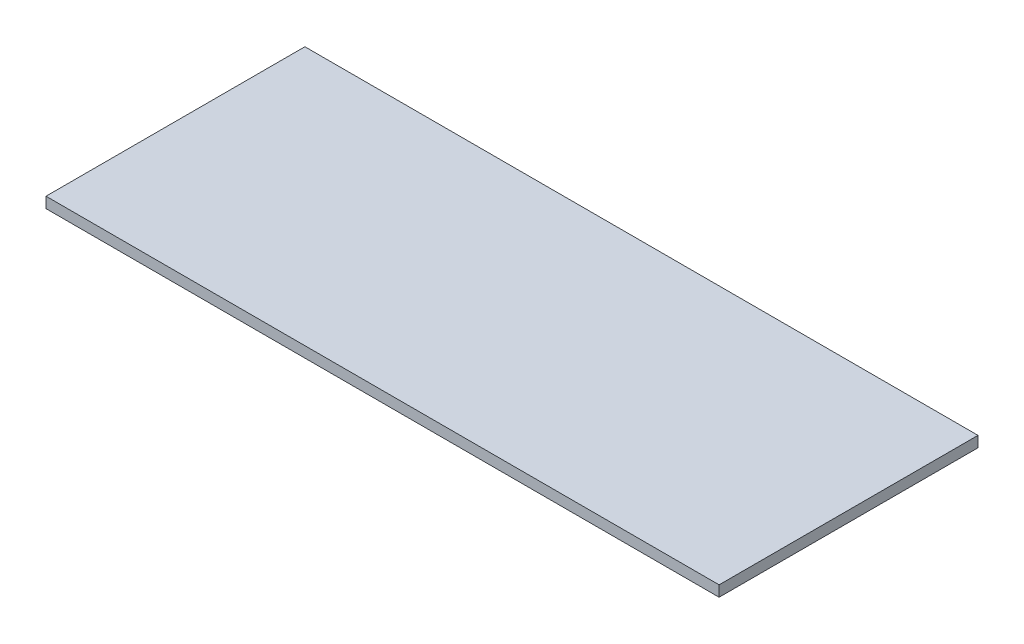
ISO-10303-21;
HEADER;
FILE_DESCRIPTION(('STEP AP214'),'2;1');
FILE_NAME('part.step','',(''),(''),'','','');
FILE_SCHEMA(('AUTOMOTIVE_DESIGN { 1 0 10303 214 1 1 1 1 }'));
ENDSEC;
DATA;
#1=APPLICATION_CONTEXT('core data for automotive mechanical design processes');
#2=APPLICATION_PROTOCOL_DEFINITION('international standard','automotive_design',2000,#1);
#3=PRODUCT_CONTEXT('',#1,'mechanical');
#4=PRODUCT('Part','Part','',(#3));
#5=PRODUCT_RELATED_PRODUCT_CATEGORY('part','',(#4));
#6=PRODUCT_DEFINITION_FORMATION('','',#4);
#7=PRODUCT_DEFINITION_CONTEXT('part definition',#1,'design');
#8=PRODUCT_DEFINITION('design','',#6,#7);
#9=PRODUCT_DEFINITION_SHAPE('','',#8);
#10=(LENGTH_UNIT() NAMED_UNIT(*) SI_UNIT(.MILLI.,.METRE.));
#11=(NAMED_UNIT(*) PLANE_ANGLE_UNIT() SI_UNIT($,.RADIAN.));
#12=(NAMED_UNIT(*) SI_UNIT($,.STERADIAN.) SOLID_ANGLE_UNIT());
#13=UNCERTAINTY_MEASURE_WITH_UNIT(LENGTH_MEASURE(1.E-05),#10,'distance_accuracy_value','');
#14=(GEOMETRIC_REPRESENTATION_CONTEXT(3) GLOBAL_UNCERTAINTY_ASSIGNED_CONTEXT((#13)) GLOBAL_UNIT_ASSIGNED_CONTEXT((#10,
#11,#12)) REPRESENTATION_CONTEXT('',''));
#15=CARTESIAN_POINT('',(0.,0.,0.));
#16=DIRECTION('',(0.,0.,1.));
#17=DIRECTION('',(1.,0.,0.));
#18=AXIS2_PLACEMENT_3D('',#15,#16,#17);
#19=CARTESIAN_POINT('',(0.,3.175,0.));
#20=DIRECTION('',(1.,0.,0.));
#21=DIRECTION('',(0.,0.,-1.));
#22=AXIS2_PLACEMENT_3D('',#19,#20,#21);
#23=PLANE('',#22);
#24=DIRECTION('',(0.,0.,1.));
#25=VECTOR('',#24,1.);
#26=CARTESIAN_POINT('',(0.,0.,0.));
#27=LINE('',#26,#25);
#28=CARTESIAN_POINT('',(0.,0.,-76.2));
#29=VERTEX_POINT('',#28);
#30=CARTESIAN_POINT('',(0.,0.,0.));
#31=VERTEX_POINT('',#30);
#32=EDGE_CURVE('E96',#29,#31,#27,.T.);
#33=ORIENTED_EDGE('',*,*,#32,.T.);
#34=DIRECTION('',(0.,-1.,0.));
#35=VECTOR('',#34,1.);
#36=CARTESIAN_POINT('',(0.,3.175,0.));
#37=LINE('',#36,#35);
#38=CARTESIAN_POINT('',(0.,3.175,0.));
#39=VERTEX_POINT('',#38);
#40=EDGE_CURVE('E11',#39,#31,#37,.T.);
#41=ORIENTED_EDGE('',*,*,#40,.F.);
#42=DIRECTION('',(0.,0.,1.));
#43=VECTOR('',#42,1.);
#44=CARTESIAN_POINT('',(0.,3.175,0.));
#45=LINE('',#44,#43);
#46=CARTESIAN_POINT('',(0.,3.175,-76.2));
#47=VERTEX_POINT('',#46);
#48=EDGE_CURVE('E84',#47,#39,#45,.T.);
#49=ORIENTED_EDGE('',*,*,#48,.F.);
#50=DIRECTION('',(0.,-1.,0.));
#51=VECTOR('',#50,1.);
#52=CARTESIAN_POINT('',(0.,3.175,-76.2));
#53=LINE('',#52,#51);
#54=EDGE_CURVE('E92',#47,#29,#53,.T.);
#55=ORIENTED_EDGE('',*,*,#54,.T.);
#56=EDGE_LOOP('',(#33,#41,#49,#55));
#57=FACE_BOUND('',#56,.T.);
#58=ADVANCED_FACE('F33',(#57),#23,.F.);
#59=CARTESIAN_POINT('',(0.,3.175,0.));
#60=DIRECTION('',(0.,0.,-1.));
#61=DIRECTION('',(-1.,0.,0.));
#62=AXIS2_PLACEMENT_3D('',#59,#60,#61);
#63=PLANE('',#62);
#64=DIRECTION('',(1.,0.,0.));
#65=VECTOR('',#64,1.);
#66=CARTESIAN_POINT('',(0.,0.,0.));
#67=LINE('',#66,#65);
#68=CARTESIAN_POINT('',(198.12,0.,0.));
#69=VERTEX_POINT('',#68);
#70=EDGE_CURVE('E88',#31,#69,#67,.T.);
#71=ORIENTED_EDGE('',*,*,#70,.T.);
#72=DIRECTION('',(0.,-1.,0.));
#73=VECTOR('',#72,1.);
#74=CARTESIAN_POINT('',(198.12,3.175,0.));
#75=LINE('',#74,#73);
#76=CARTESIAN_POINT('',(198.12,3.175,0.));
#77=VERTEX_POINT('',#76);
#78=EDGE_CURVE('E41',#77,#69,#75,.T.);
#79=ORIENTED_EDGE('',*,*,#78,.F.);
#80=DIRECTION('',(1.,0.,0.));
#81=VECTOR('',#80,1.);
#82=CARTESIAN_POINT('',(0.,3.175,0.));
#83=LINE('',#82,#81);
#84=EDGE_CURVE('E79',#39,#77,#83,.T.);
#85=ORIENTED_EDGE('',*,*,#84,.F.);
#86=ORIENTED_EDGE('',*,*,#40,.T.);
#87=EDGE_LOOP('',(#71,#79,#85,#86));
#88=FACE_BOUND('',#87,.T.);
#89=ADVANCED_FACE('F87',(#88),#63,.F.);
#90=CARTESIAN_POINT('',(198.12,3.175,0.));
#91=DIRECTION('',(-1.,0.,0.));
#92=DIRECTION('',(0.,0.,1.));
#93=AXIS2_PLACEMENT_3D('',#90,#91,#92);
#94=PLANE('',#93);
#95=DIRECTION('',(0.,0.,-1.));
#96=VECTOR('',#95,1.);
#97=CARTESIAN_POINT('',(198.12,0.,0.));
#98=LINE('',#97,#96);
#99=CARTESIAN_POINT('',(198.12,0.,-76.2));
#100=VERTEX_POINT('',#99);
#101=EDGE_CURVE('E66',#69,#100,#98,.T.);
#102=ORIENTED_EDGE('',*,*,#101,.T.);
#103=DIRECTION('',(0.,-1.,0.));
#104=VECTOR('',#103,1.);
#105=CARTESIAN_POINT('',(198.12,3.175,-76.2));
#106=LINE('',#105,#104);
#107=CARTESIAN_POINT('',(198.12,3.175,-76.2));
#108=VERTEX_POINT('',#107);
#109=EDGE_CURVE('E89',#108,#100,#106,.T.);
#110=ORIENTED_EDGE('',*,*,#109,.F.);
#111=DIRECTION('',(0.,0.,-1.));
#112=VECTOR('',#111,1.);
#113=CARTESIAN_POINT('',(198.12,3.175,0.));
#114=LINE('',#113,#112);
#115=EDGE_CURVE('E82',#77,#108,#114,.T.);
#116=ORIENTED_EDGE('',*,*,#115,.F.);
#117=ORIENTED_EDGE('',*,*,#78,.T.);
#118=EDGE_LOOP('',(#102,#110,#116,#117));
#119=FACE_BOUND('',#118,.T.);
#120=ADVANCED_FACE('F90',(#119),#94,.F.);
#121=CARTESIAN_POINT('',(0.,3.175,-76.2));
#122=DIRECTION('',(0.,0.,1.));
#123=DIRECTION('',(1.,0.,0.));
#124=AXIS2_PLACEMENT_3D('',#121,#122,#123);
#125=PLANE('',#124);
#126=DIRECTION('',(-1.,0.,0.));
#127=VECTOR('',#126,1.);
#128=CARTESIAN_POINT('',(0.,0.,-76.2));
#129=LINE('',#128,#127);
#130=EDGE_CURVE('E72',#100,#29,#129,.T.);
#131=ORIENTED_EDGE('',*,*,#130,.T.);
#132=ORIENTED_EDGE('',*,*,#54,.F.);
#133=DIRECTION('',(-1.,0.,0.));
#134=VECTOR('',#133,1.);
#135=CARTESIAN_POINT('',(0.,3.175,-76.2));
#136=LINE('',#135,#134);
#137=EDGE_CURVE('E49',#108,#47,#136,.T.);
#138=ORIENTED_EDGE('',*,*,#137,.F.);
#139=ORIENTED_EDGE('',*,*,#109,.T.);
#140=EDGE_LOOP('',(#131,#132,#138,#139));
#141=FACE_BOUND('',#140,.T.);
#142=ADVANCED_FACE('F103',(#141),#125,.F.);
#143=CARTESIAN_POINT('',(0.,3.175,0.));
#144=DIRECTION('',(0.,-1.,0.));
#145=DIRECTION('',(0.,0.,-1.));
#146=AXIS2_PLACEMENT_3D('',#143,#144,#145);
#147=PLANE('',#146);
#148=ORIENTED_EDGE('',*,*,#48,.T.);
#149=ORIENTED_EDGE('',*,*,#84,.T.);
#150=ORIENTED_EDGE('',*,*,#115,.T.);
#151=ORIENTED_EDGE('',*,*,#137,.T.);
#152=EDGE_LOOP('',(#148,#149,#150,#151));
#153=FACE_BOUND('',#152,.T.);
#154=ADVANCED_FACE('F80',(#153),#147,.F.);
#155=CARTESIAN_POINT('',(0.,0.,0.));
#156=DIRECTION('',(0.,-1.,0.));
#157=DIRECTION('',(0.,0.,-1.));
#158=AXIS2_PLACEMENT_3D('',#155,#156,#157);
#159=PLANE('',#158);
#160=ORIENTED_EDGE('',*,*,#32,.F.);
#161=ORIENTED_EDGE('',*,*,#130,.F.);
#162=ORIENTED_EDGE('',*,*,#101,.F.);
#163=ORIENTED_EDGE('',*,*,#70,.F.);
#164=EDGE_LOOP('',(#160,#161,#162,#163));
#165=FACE_BOUND('',#164,.T.);
#166=ADVANCED_FACE('F106',(#165),#159,.T.);
#167=CLOSED_SHELL('',(#58,#89,#120,#142,#154,#166));
#168=MANIFOLD_SOLID_BREP('B2',#167);
#169=ADVANCED_BREP_SHAPE_REPRESENTATION('',(#18,#168),#14);
#170=SHAPE_DEFINITION_REPRESENTATION(#9,#169);
ENDSEC;
END-ISO-10303-21;
